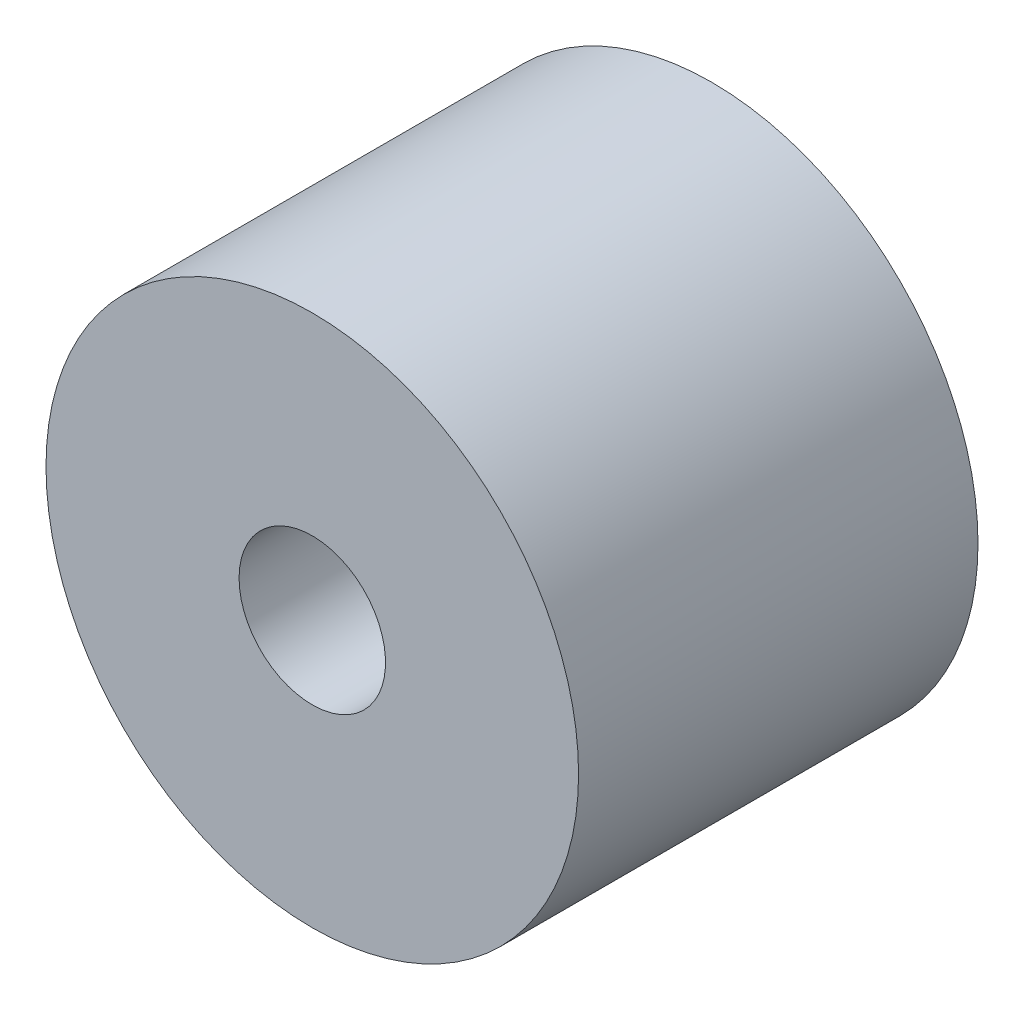
ISO-10303-21;
HEADER;
FILE_DESCRIPTION(('STEP AP214'),'2;1');
FILE_NAME('part.step','',(''),(''),'','','');
FILE_SCHEMA(('AUTOMOTIVE_DESIGN { 1 0 10303 214 1 1 1 1 }'));
ENDSEC;
DATA;
#1=APPLICATION_CONTEXT('core data for automotive mechanical design processes');
#2=APPLICATION_PROTOCOL_DEFINITION('international standard','automotive_design',2000,#1);
#3=PRODUCT_CONTEXT('',#1,'mechanical');
#4=PRODUCT('Part','Part','',(#3));
#5=PRODUCT_RELATED_PRODUCT_CATEGORY('part','',(#4));
#6=PRODUCT_DEFINITION_FORMATION('','',#4);
#7=PRODUCT_DEFINITION_CONTEXT('part definition',#1,'design');
#8=PRODUCT_DEFINITION('design','',#6,#7);
#9=PRODUCT_DEFINITION_SHAPE('','',#8);
#10=(LENGTH_UNIT() NAMED_UNIT(*) SI_UNIT(.MILLI.,.METRE.));
#11=(NAMED_UNIT(*) PLANE_ANGLE_UNIT() SI_UNIT($,.RADIAN.));
#12=(NAMED_UNIT(*) SI_UNIT($,.STERADIAN.) SOLID_ANGLE_UNIT());
#13=UNCERTAINTY_MEASURE_WITH_UNIT(LENGTH_MEASURE(1.E-05),#10,'distance_accuracy_value','');
#14=(GEOMETRIC_REPRESENTATION_CONTEXT(3) GLOBAL_UNCERTAINTY_ASSIGNED_CONTEXT((#13)) GLOBAL_UNIT_ASSIGNED_CONTEXT((#10,
#11,#12)) REPRESENTATION_CONTEXT('',''));
#15=CARTESIAN_POINT('',(0.,0.,0.));
#16=DIRECTION('',(0.,0.,1.));
#17=DIRECTION('',(1.,0.,0.));
#18=AXIS2_PLACEMENT_3D('',#15,#16,#17);
#19=CARTESIAN_POINT('',(-79.9999999999999,29.0002193563908,153.));
#20=DIRECTION('',(0.,0.,-1.));
#21=DIRECTION('',(-1.,0.,0.));
#22=AXIS2_PLACEMENT_3D('',#19,#20,#21);
#23=PLANE('',#22);
#24=CARTESIAN_POINT('',(-8.94079999999994,25.2854193563909,153.));
#25=DIRECTION('',(0.,0.,-1.));
#26=DIRECTION('',(-1.,0.,0.));
#27=AXIS2_PLACEMENT_3D('',#24,#25,#26);
#28=CIRCLE('',#27,3.);
#29=CARTESIAN_POINT('',(-11.9407999999999,25.2854193563909,153.));
#30=VERTEX_POINT('',#29);
#31=EDGE_CURVE('E41',#30,#30,#28,.T.);
#32=ORIENTED_EDGE('',*,*,#31,.F.);
#33=EDGE_LOOP('',(#32));
#34=FACE_BOUND('',#33,.T.);
#35=CARTESIAN_POINT('',(-8.94079999999994,25.2854193563909,153.));
#36=DIRECTION('',(0.,0.,-1.));
#37=DIRECTION('',(-1.,0.,0.));
#38=AXIS2_PLACEMENT_3D('',#35,#36,#37);
#39=CIRCLE('',#38,0.824999999999997);
#40=CARTESIAN_POINT('',(-9.76579999999994,25.2854193563909,153.));
#41=VERTEX_POINT('',#40);
#42=EDGE_CURVE('E50',#41,#41,#39,.F.);
#43=ORIENTED_EDGE('',*,*,#42,.F.);
#44=EDGE_LOOP('',(#43));
#45=FACE_BOUND('',#44,.T.);
#46=ADVANCED_FACE('F35',(#34,#45),#23,.F.);
#47=CARTESIAN_POINT('',(-8.94079999999994,25.2854193563909,148.5));
#48=DIRECTION('',(0.,0.,-1.));
#49=DIRECTION('',(-1.,0.,0.));
#50=AXIS2_PLACEMENT_3D('',#47,#48,#49);
#51=PLANE('',#50);
#52=CARTESIAN_POINT('',(-8.94079999999994,25.2854193563909,148.5));
#53=DIRECTION('',(0.,0.,-1.));
#54=DIRECTION('',(-1.,0.,0.));
#55=AXIS2_PLACEMENT_3D('',#52,#53,#54);
#56=CIRCLE('',#55,3.);
#57=CARTESIAN_POINT('',(-11.9407999999999,25.2854193563909,148.5));
#58=VERTEX_POINT('',#57);
#59=EDGE_CURVE('E45',#58,#58,#56,.T.);
#60=ORIENTED_EDGE('',*,*,#59,.T.);
#61=EDGE_LOOP('',(#60));
#62=FACE_BOUND('',#61,.T.);
#63=CARTESIAN_POINT('',(-8.94079999999994,25.2854193563909,148.5));
#64=DIRECTION('',(0.,0.,-1.));
#65=DIRECTION('',(-1.,0.,0.));
#66=AXIS2_PLACEMENT_3D('',#63,#64,#65);
#67=CIRCLE('',#66,0.824999999999997);
#68=CARTESIAN_POINT('',(-9.76579999999994,25.2854193563909,148.5));
#69=VERTEX_POINT('',#68);
#70=EDGE_CURVE('E10',#69,#69,#67,.T.);
#71=ORIENTED_EDGE('',*,*,#70,.F.);
#72=EDGE_LOOP('',(#71));
#73=FACE_BOUND('',#72,.T.);
#74=ADVANCED_FACE('F58',(#62,#73),#51,.T.);
#75=CARTESIAN_POINT('',(-8.94079999999994,25.2854193563909,148.5));
#76=DIRECTION('',(0.,0.,1.));
#77=DIRECTION('',(1.,0.,0.));
#78=AXIS2_PLACEMENT_3D('',#75,#76,#77);
#79=CYLINDRICAL_SURFACE('',#78,3.);
#80=ORIENTED_EDGE('',*,*,#59,.F.);
#81=EDGE_LOOP('',(#80));
#82=FACE_BOUND('',#81,.T.);
#83=ORIENTED_EDGE('',*,*,#31,.T.);
#84=EDGE_LOOP('',(#83));
#85=FACE_BOUND('',#84,.T.);
#86=ADVANCED_FACE('F63',(#82,#85),#79,.T.);
#87=CARTESIAN_POINT('',(-8.94079999999994,25.2854193563909,148.5));
#88=DIRECTION('',(0.,0.,1.));
#89=DIRECTION('',(1.,0.,0.));
#90=AXIS2_PLACEMENT_3D('',#87,#88,#89);
#91=CYLINDRICAL_SURFACE('',#90,0.824999999999997);
#92=ORIENTED_EDGE('',*,*,#70,.T.);
#93=EDGE_LOOP('',(#92));
#94=FACE_BOUND('',#93,.T.);
#95=ORIENTED_EDGE('',*,*,#42,.T.);
#96=EDGE_LOOP('',(#95));
#97=FACE_BOUND('',#96,.T.);
#98=ADVANCED_FACE('F55',(#94,#97),#91,.F.);
#99=CLOSED_SHELL('',(#46,#74,#86,#98));
#100=MANIFOLD_SOLID_BREP('B2',#99);
#101=ADVANCED_BREP_SHAPE_REPRESENTATION('',(#18,#100),#14);
#102=SHAPE_DEFINITION_REPRESENTATION(#9,#101);
ENDSEC;
END-ISO-10303-21;
